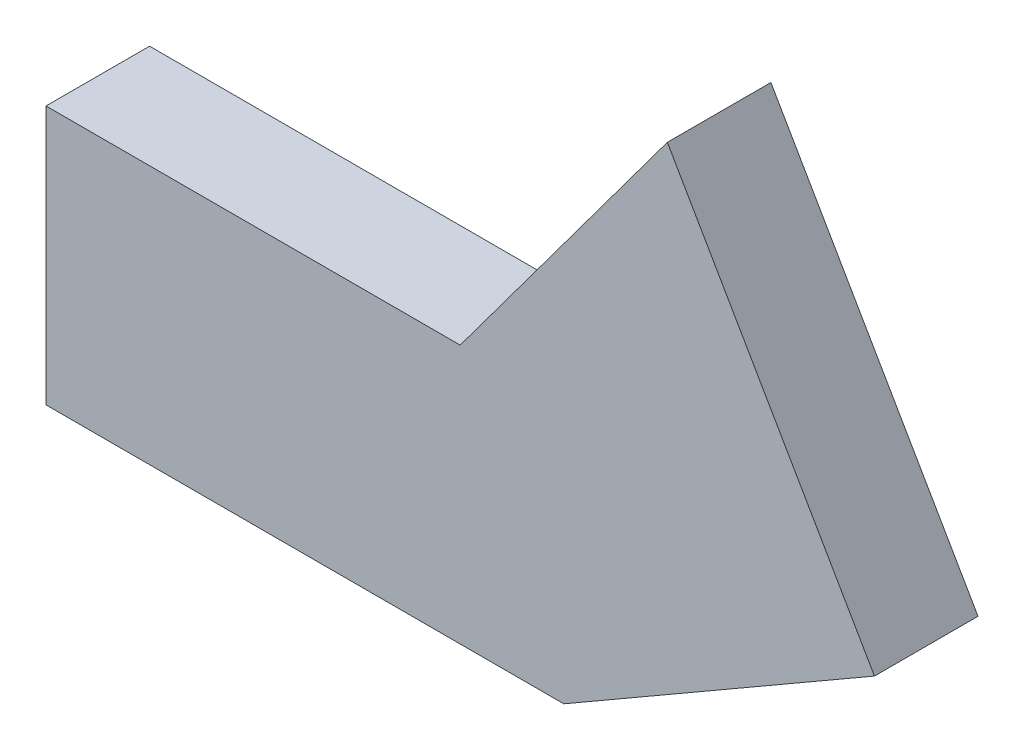
ISO-10303-21;
HEADER;
FILE_DESCRIPTION(('STEP AP214'),'2;1');
FILE_NAME('part.step','',(''),(''),'','','');
FILE_SCHEMA(('AUTOMOTIVE_DESIGN { 1 0 10303 214 1 1 1 1 }'));
ENDSEC;
DATA;
#1=APPLICATION_CONTEXT('core data for automotive mechanical design processes');
#2=APPLICATION_PROTOCOL_DEFINITION('international standard','automotive_design',2000,#1);
#3=PRODUCT_CONTEXT('',#1,'mechanical');
#4=PRODUCT('Part','Part','',(#3));
#5=PRODUCT_RELATED_PRODUCT_CATEGORY('part','',(#4));
#6=PRODUCT_DEFINITION_FORMATION('','',#4);
#7=PRODUCT_DEFINITION_CONTEXT('part definition',#1,'design');
#8=PRODUCT_DEFINITION('design','',#6,#7);
#9=PRODUCT_DEFINITION_SHAPE('','',#8);
#10=(LENGTH_UNIT() NAMED_UNIT(*) SI_UNIT(.MILLI.,.METRE.));
#11=(NAMED_UNIT(*) PLANE_ANGLE_UNIT() SI_UNIT($,.RADIAN.));
#12=(NAMED_UNIT(*) SI_UNIT($,.STERADIAN.) SOLID_ANGLE_UNIT());
#13=UNCERTAINTY_MEASURE_WITH_UNIT(LENGTH_MEASURE(1.E-05),#10,'distance_accuracy_value','');
#14=(GEOMETRIC_REPRESENTATION_CONTEXT(3) GLOBAL_UNCERTAINTY_ASSIGNED_CONTEXT((#13)) GLOBAL_UNIT_ASSIGNED_CONTEXT((#10,
#11,#12)) REPRESENTATION_CONTEXT('',''));
#15=CARTESIAN_POINT('',(0.,0.,0.));
#16=DIRECTION('',(0.,0.,1.));
#17=DIRECTION('',(1.,0.,0.));
#18=AXIS2_PLACEMENT_3D('',#15,#16,#17);
#19=CARTESIAN_POINT('',(0.,50.,20.));
#20=DIRECTION('',(1.,0.,0.));
#21=DIRECTION('',(0.,0.,-1.));
#22=AXIS2_PLACEMENT_3D('',#19,#20,#21);
#23=PLANE('',#22);
#24=DIRECTION('',(0.,-1.,0.));
#25=VECTOR('',#24,1.);
#26=CARTESIAN_POINT('',(0.,50.,0.));
#27=LINE('',#26,#25);
#28=CARTESIAN_POINT('',(0.,50.,0.));
#29=VERTEX_POINT('',#28);
#30=CARTESIAN_POINT('',(0.,0.,0.));
#31=VERTEX_POINT('',#30);
#32=EDGE_CURVE('E128',#29,#31,#27,.T.);
#33=ORIENTED_EDGE('',*,*,#32,.T.);
#34=DIRECTION('',(0.,0.,-1.));
#35=VECTOR('',#34,1.);
#36=CARTESIAN_POINT('',(0.,0.,20.));
#37=LINE('',#36,#35);
#38=CARTESIAN_POINT('',(0.,0.,20.));
#39=VERTEX_POINT('',#38);
#40=EDGE_CURVE('E11',#39,#31,#37,.T.);
#41=ORIENTED_EDGE('',*,*,#40,.F.);
#42=DIRECTION('',(0.,-1.,0.));
#43=VECTOR('',#42,1.);
#44=CARTESIAN_POINT('',(0.,50.,20.));
#45=LINE('',#44,#43);
#46=CARTESIAN_POINT('',(0.,50.,20.));
#47=VERTEX_POINT('',#46);
#48=EDGE_CURVE('E144',#47,#39,#45,.T.);
#49=ORIENTED_EDGE('',*,*,#48,.F.);
#50=DIRECTION('',(0.,0.,-1.));
#51=VECTOR('',#50,1.);
#52=CARTESIAN_POINT('',(0.,50.,20.));
#53=LINE('',#52,#51);
#54=EDGE_CURVE('E124',#47,#29,#53,.T.);
#55=ORIENTED_EDGE('',*,*,#54,.T.);
#56=EDGE_LOOP('',(#33,#41,#49,#55));
#57=FACE_BOUND('',#56,.T.);
#58=ADVANCED_FACE('F39',(#57),#23,.F.);
#59=CARTESIAN_POINT('',(0.,0.,20.));
#60=DIRECTION('',(0.,1.,0.));
#61=DIRECTION('',(0.,0.,1.));
#62=AXIS2_PLACEMENT_3D('',#59,#60,#61);
#63=PLANE('',#62);
#64=DIRECTION('',(1.,0.,0.));
#65=VECTOR('',#64,1.);
#66=CARTESIAN_POINT('',(0.,0.,0.));
#67=LINE('',#66,#65);
#68=CARTESIAN_POINT('',(100.,0.,0.));
#69=VERTEX_POINT('',#68);
#70=EDGE_CURVE('E132',#31,#69,#67,.T.);
#71=ORIENTED_EDGE('',*,*,#70,.T.);
#72=DIRECTION('',(0.,0.,-1.));
#73=VECTOR('',#72,1.);
#74=CARTESIAN_POINT('',(100.,0.,20.));
#75=LINE('',#74,#73);
#76=CARTESIAN_POINT('',(100.,0.,20.));
#77=VERTEX_POINT('',#76);
#78=EDGE_CURVE('E48',#77,#69,#75,.T.);
#79=ORIENTED_EDGE('',*,*,#78,.F.);
#80=DIRECTION('',(1.,0.,0.));
#81=VECTOR('',#80,1.);
#82=CARTESIAN_POINT('',(0.,0.,20.));
#83=LINE('',#82,#81);
#84=EDGE_CURVE('E93',#39,#77,#83,.T.);
#85=ORIENTED_EDGE('',*,*,#84,.F.);
#86=ORIENTED_EDGE('',*,*,#40,.T.);
#87=EDGE_LOOP('',(#71,#79,#85,#86));
#88=FACE_BOUND('',#87,.T.);
#89=ADVANCED_FACE('F172',(#88),#63,.F.);
#90=CARTESIAN_POINT('',(100.,0.,20.));
#91=DIRECTION('',(-0.500000000000001,0.866025403784438,0.));
#92=DIRECTION('',(-0.866025403784438,-0.500000000000001,0.));
#93=AXIS2_PLACEMENT_3D('',#90,#91,#92);
#94=PLANE('',#93);
#95=DIRECTION('',(0.866025403784438,0.500000000000001,0.));
#96=VECTOR('',#95,1.);
#97=CARTESIAN_POINT('',(100.,0.,0.));
#98=LINE('',#97,#96);
#99=CARTESIAN_POINT('',(160.,34.6410161513776,0.));
#100=VERTEX_POINT('',#99);
#101=EDGE_CURVE('E135',#69,#100,#98,.T.);
#102=ORIENTED_EDGE('',*,*,#101,.T.);
#103=DIRECTION('',(0.,0.,-1.));
#104=VECTOR('',#103,1.);
#105=CARTESIAN_POINT('',(160.,34.6410161513776,20.));
#106=LINE('',#105,#104);
#107=CARTESIAN_POINT('',(160.,34.6410161513776,20.));
#108=VERTEX_POINT('',#107);
#109=EDGE_CURVE('E117',#108,#100,#106,.T.);
#110=ORIENTED_EDGE('',*,*,#109,.F.);
#111=DIRECTION('',(0.866025403784438,0.500000000000001,0.));
#112=VECTOR('',#111,1.);
#113=CARTESIAN_POINT('',(100.,0.,20.));
#114=LINE('',#113,#112);
#115=EDGE_CURVE('E106',#77,#108,#114,.T.);
#116=ORIENTED_EDGE('',*,*,#115,.F.);
#117=ORIENTED_EDGE('',*,*,#78,.T.);
#118=EDGE_LOOP('',(#102,#110,#116,#117));
#119=FACE_BOUND('',#118,.T.);
#120=ADVANCED_FACE('F154',(#119),#94,.F.);
#121=CARTESIAN_POINT('',(160.,34.6410161513776,20.));
#122=DIRECTION('',(-0.866025403784438,-0.500000000000001,0.));
#123=DIRECTION('',(0.500000000000001,-0.866025403784438,0.));
#124=AXIS2_PLACEMENT_3D('',#121,#122,#123);
#125=PLANE('',#124);
#126=DIRECTION('',(-0.500000000000001,0.866025403784438,0.));
#127=VECTOR('',#126,1.);
#128=CARTESIAN_POINT('',(160.,34.6410161513776,0.));
#129=LINE('',#128,#127);
#130=CARTESIAN_POINT('',(120.,103.923048454133,0.));
#131=VERTEX_POINT('',#130);
#132=EDGE_CURVE('E115',#100,#131,#129,.T.);
#133=ORIENTED_EDGE('',*,*,#132,.T.);
#134=DIRECTION('',(0.,0.,-1.));
#135=VECTOR('',#134,1.);
#136=CARTESIAN_POINT('',(120.,103.923048454133,20.));
#137=LINE('',#136,#135);
#138=CARTESIAN_POINT('',(120.,103.923048454133,20.));
#139=VERTEX_POINT('',#138);
#140=EDGE_CURVE('E112',#139,#131,#137,.T.);
#141=ORIENTED_EDGE('',*,*,#140,.F.);
#142=DIRECTION('',(-0.500000000000001,0.866025403784438,0.));
#143=VECTOR('',#142,1.);
#144=CARTESIAN_POINT('',(160.,34.6410161513776,20.));
#145=LINE('',#144,#143);
#146=EDGE_CURVE('E100',#108,#139,#145,.T.);
#147=ORIENTED_EDGE('',*,*,#146,.F.);
#148=ORIENTED_EDGE('',*,*,#109,.T.);
#149=EDGE_LOOP('',(#133,#141,#147,#148));
#150=FACE_BOUND('',#149,.T.);
#151=ADVANCED_FACE('F113',(#150),#125,.F.);
#152=CARTESIAN_POINT('',(120.,103.923048454133,20.));
#153=DIRECTION('',(0.803150931464229,-0.595775613203613,0.));
#154=DIRECTION('',(0.595775613203613,0.803150931464229,0.));
#155=AXIS2_PLACEMENT_3D('',#152,#153,#154);
#156=PLANE('',#155);
#157=DIRECTION('',(-0.595775613203613,-0.803150931464229,0.));
#158=VECTOR('',#157,1.);
#159=CARTESIAN_POINT('',(120.,103.923048454133,0.));
#160=LINE('',#159,#158);
#161=CARTESIAN_POINT('',(80.,50.,0.));
#162=VERTEX_POINT('',#161);
#163=EDGE_CURVE('E79',#131,#162,#160,.T.);
#164=ORIENTED_EDGE('',*,*,#163,.T.);
#165=DIRECTION('',(0.,0.,-1.));
#166=VECTOR('',#165,1.);
#167=CARTESIAN_POINT('',(80.,50.,20.));
#168=LINE('',#167,#166);
#169=CARTESIAN_POINT('',(80.,50.,20.));
#170=VERTEX_POINT('',#169);
#171=EDGE_CURVE('E118',#170,#162,#168,.T.);
#172=ORIENTED_EDGE('',*,*,#171,.F.);
#173=DIRECTION('',(-0.595775613203613,-0.803150931464229,0.));
#174=VECTOR('',#173,1.);
#175=CARTESIAN_POINT('',(120.,103.923048454133,20.));
#176=LINE('',#175,#174);
#177=EDGE_CURVE('E104',#139,#170,#176,.T.);
#178=ORIENTED_EDGE('',*,*,#177,.F.);
#179=ORIENTED_EDGE('',*,*,#140,.T.);
#180=EDGE_LOOP('',(#164,#172,#178,#179));
#181=FACE_BOUND('',#180,.T.);
#182=ADVANCED_FACE('F120',(#181),#156,.F.);
#183=CARTESIAN_POINT('',(80.,50.,20.));
#184=DIRECTION('',(0.,-1.,0.));
#185=DIRECTION('',(1.,0.,0.));
#186=AXIS2_PLACEMENT_3D('',#183,#184,#185);
#187=PLANE('',#186);
#188=DIRECTION('',(-1.,0.,0.));
#189=VECTOR('',#188,1.);
#190=CARTESIAN_POINT('',(80.,50.,0.));
#191=LINE('',#190,#189);
#192=EDGE_CURVE('E85',#162,#29,#191,.T.);
#193=ORIENTED_EDGE('',*,*,#192,.T.);
#194=ORIENTED_EDGE('',*,*,#54,.F.);
#195=DIRECTION('',(-1.,0.,0.));
#196=VECTOR('',#195,1.);
#197=CARTESIAN_POINT('',(80.,50.,20.));
#198=LINE('',#197,#196);
#199=EDGE_CURVE('E56',#170,#47,#198,.T.);
#200=ORIENTED_EDGE('',*,*,#199,.F.);
#201=ORIENTED_EDGE('',*,*,#171,.T.);
#202=EDGE_LOOP('',(#193,#194,#200,#201));
#203=FACE_BOUND('',#202,.T.);
#204=ADVANCED_FACE('F161',(#203),#187,.F.);
#205=CARTESIAN_POINT('',(0.,0.,20.));
#206=DIRECTION('',(0.,0.,1.));
#207=DIRECTION('',(1.,0.,0.));
#208=AXIS2_PLACEMENT_3D('',#205,#206,#207);
#209=PLANE('',#208);
#210=ORIENTED_EDGE('',*,*,#48,.T.);
#211=ORIENTED_EDGE('',*,*,#84,.T.);
#212=ORIENTED_EDGE('',*,*,#115,.T.);
#213=ORIENTED_EDGE('',*,*,#146,.T.);
#214=ORIENTED_EDGE('',*,*,#177,.T.);
#215=ORIENTED_EDGE('',*,*,#199,.T.);
#216=EDGE_LOOP('',(#210,#211,#212,#213,#214,#215));
#217=FACE_BOUND('',#216,.T.);
#218=ADVANCED_FACE('F102',(#217),#209,.T.);
#219=CARTESIAN_POINT('',(0.,0.,0.));
#220=DIRECTION('',(0.,0.,1.));
#221=DIRECTION('',(1.,0.,0.));
#222=AXIS2_PLACEMENT_3D('',#219,#220,#221);
#223=PLANE('',#222);
#224=ORIENTED_EDGE('',*,*,#32,.F.);
#225=ORIENTED_EDGE('',*,*,#192,.F.);
#226=ORIENTED_EDGE('',*,*,#163,.F.);
#227=ORIENTED_EDGE('',*,*,#132,.F.);
#228=ORIENTED_EDGE('',*,*,#101,.F.);
#229=ORIENTED_EDGE('',*,*,#70,.F.);
#230=EDGE_LOOP('',(#224,#225,#226,#227,#228,#229));
#231=FACE_BOUND('',#230,.T.);
#232=ADVANCED_FACE('F157',(#231),#223,.F.);
#233=CLOSED_SHELL('',(#58,#89,#120,#151,#182,#204,#218,#232));
#234=MANIFOLD_SOLID_BREP('B2',#233);
#235=ADVANCED_BREP_SHAPE_REPRESENTATION('',(#18,#234),#14);
#236=SHAPE_DEFINITION_REPRESENTATION(#9,#235);
ENDSEC;
END-ISO-10303-21;
